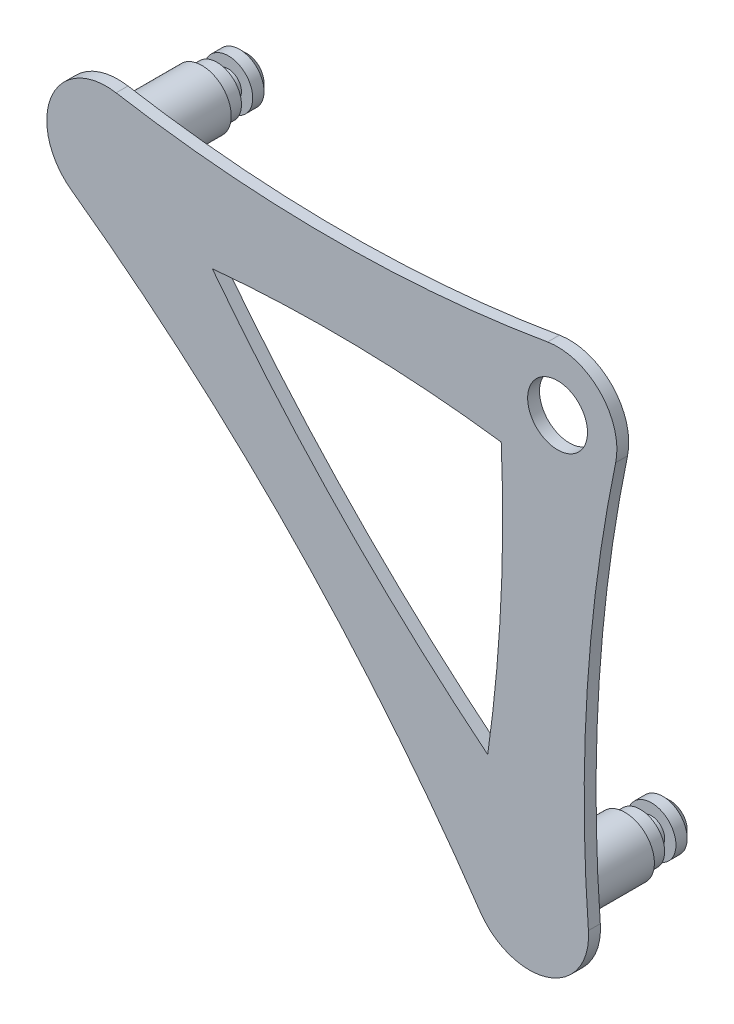
ISO-10303-21;
HEADER;
FILE_DESCRIPTION(('STEP AP214'),'2;1');
FILE_NAME('part.step','',(''),(''),'','','');
FILE_SCHEMA(('AUTOMOTIVE_DESIGN { 1 0 10303 214 1 1 1 1 }'));
ENDSEC;
DATA;
#1=APPLICATION_CONTEXT('core data for automotive mechanical design processes');
#2=APPLICATION_PROTOCOL_DEFINITION('international standard','automotive_design',2000,#1);
#3=PRODUCT_CONTEXT('',#1,'mechanical');
#4=PRODUCT('Part','Part','',(#3));
#5=PRODUCT_RELATED_PRODUCT_CATEGORY('part','',(#4));
#6=PRODUCT_DEFINITION_FORMATION('','',#4);
#7=PRODUCT_DEFINITION_CONTEXT('part definition',#1,'design');
#8=PRODUCT_DEFINITION('design','',#6,#7);
#9=PRODUCT_DEFINITION_SHAPE('','',#8);
#10=(LENGTH_UNIT() NAMED_UNIT(*) SI_UNIT(.MILLI.,.METRE.));
#11=(NAMED_UNIT(*) PLANE_ANGLE_UNIT() SI_UNIT($,.RADIAN.));
#12=(NAMED_UNIT(*) SI_UNIT($,.STERADIAN.) SOLID_ANGLE_UNIT());
#13=UNCERTAINTY_MEASURE_WITH_UNIT(LENGTH_MEASURE(1.E-05),#10,'distance_accuracy_value','');
#14=(GEOMETRIC_REPRESENTATION_CONTEXT(3) GLOBAL_UNCERTAINTY_ASSIGNED_CONTEXT((#13)) GLOBAL_UNIT_ASSIGNED_CONTEXT((#10,
#11,#12)) REPRESENTATION_CONTEXT('',''));
#15=CARTESIAN_POINT('',(0.,0.,0.));
#16=DIRECTION('',(0.,0.,1.));
#17=DIRECTION('',(1.,0.,0.));
#18=AXIS2_PLACEMENT_3D('',#15,#16,#17);
#19=CARTESIAN_POINT('',(-3.76712370962372,-57.9075960384852,-18.76));
#20=DIRECTION('',(0.,0.,1.));
#21=DIRECTION('',(-1.,0.,0.));
#22=AXIS2_PLACEMENT_3D('',#19,#20,#21);
#23=CYLINDRICAL_SURFACE('',#22,3.25);
#24=CARTESIAN_POINT('',(-3.76712370962372,-57.9075960384852,-12.76));
#25=DIRECTION('',(0.,0.,1.));
#26=DIRECTION('',(1.,0.,0.));
#27=AXIS2_PLACEMENT_3D('',#24,#25,#26);
#28=CIRCLE('',#27,3.25);
#29=CARTESIAN_POINT('',(-0.517123709623721,-57.9075960384852,-12.76));
#30=VERTEX_POINT('',#29);
#31=EDGE_CURVE('E191',#30,#30,#28,.T.);
#32=ORIENTED_EDGE('',*,*,#31,.F.);
#33=EDGE_LOOP('',(#32));
#34=FACE_BOUND('',#33,.T.);
#35=CARTESIAN_POINT('',(-3.76712370962372,-57.9075960384852,-14.76));
#36=DIRECTION('',(0.,0.,1.));
#37=DIRECTION('',(1.,0.,0.));
#38=AXIS2_PLACEMENT_3D('',#35,#36,#37);
#39=CIRCLE('',#38,3.25);
#40=CARTESIAN_POINT('',(-0.51712370962372,-57.9075960384852,-14.76));
#41=VERTEX_POINT('',#40);
#42=EDGE_CURVE('E318',#41,#41,#39,.T.);
#43=ORIENTED_EDGE('',*,*,#42,.T.);
#44=EDGE_LOOP('',(#43));
#45=FACE_BOUND('',#44,.T.);
#46=ADVANCED_FACE('F47',(#34,#45),#23,.T.);
#47=CARTESIAN_POINT('',(-60.06,0.,-18.76));
#48=DIRECTION('',(0.,0.,1.));
#49=DIRECTION('',(-1.,0.,0.));
#50=AXIS2_PLACEMENT_3D('',#47,#48,#49);
#51=CYLINDRICAL_SURFACE('',#50,3.25);
#52=CARTESIAN_POINT('',(-60.06,0.,-12.76));
#53=DIRECTION('',(0.,0.,1.));
#54=DIRECTION('',(1.,0.,0.));
#55=AXIS2_PLACEMENT_3D('',#52,#53,#54);
#56=CIRCLE('',#55,3.25);
#57=CARTESIAN_POINT('',(-56.81,0.,-12.76));
#58=VERTEX_POINT('',#57);
#59=EDGE_CURVE('E203',#58,#58,#56,.T.);
#60=ORIENTED_EDGE('',*,*,#59,.F.);
#61=EDGE_LOOP('',(#60));
#62=FACE_BOUND('',#61,.T.);
#63=CARTESIAN_POINT('',(-60.06,0.,-14.76));
#64=DIRECTION('',(0.,0.,1.));
#65=DIRECTION('',(1.,0.,0.));
#66=AXIS2_PLACEMENT_3D('',#63,#64,#65);
#67=CIRCLE('',#66,3.25);
#68=CARTESIAN_POINT('',(-56.81,0.,-14.76));
#69=VERTEX_POINT('',#68);
#70=EDGE_CURVE('E315',#69,#69,#67,.T.);
#71=ORIENTED_EDGE('',*,*,#70,.T.);
#72=EDGE_LOOP('',(#71));
#73=FACE_BOUND('',#72,.T.);
#74=ADVANCED_FACE('F224',(#62,#73),#51,.T.);
#75=CARTESIAN_POINT('',(-30.03,175.33696472792,-1.58));
#76=DIRECTION('',(0.,0.,1.));
#77=DIRECTION('',(-1.,0.,0.));
#78=AXIS2_PLACEMENT_3D('',#75,#76,#77);
#79=CYLINDRICAL_SURFACE('',#78,170.);
#80=CARTESIAN_POINT('',(-30.03,175.33696472792,0.));
#81=DIRECTION('',(0.,0.,1.));
#82=DIRECTION('',(1.,0.,0.));
#83=AXIS2_PLACEMENT_3D('',#80,#81,#82);
#84=CIRCLE('',#83,170.);
#85=CARTESIAN_POINT('',(-1.33192815785036,7.77676458318788,0.));
#86=VERTEX_POINT('',#85);
#87=CARTESIAN_POINT('',(-58.7280718421496,7.77676458318788,0.));
#88=VERTEX_POINT('',#87);
#89=EDGE_CURVE('E164',#86,#88,#84,.F.);
#90=ORIENTED_EDGE('',*,*,#89,.F.);
#91=DIRECTION('',(0.,0.,1.));
#92=VECTOR('',#91,1.);
#93=CARTESIAN_POINT('',(-1.33192815785036,7.77676458318788,-1.58));
#94=LINE('',#93,#92);
#95=CARTESIAN_POINT('',(-1.33192815785036,7.77676458318788,-1.58));
#96=VERTEX_POINT('',#95);
#97=EDGE_CURVE('E180',#96,#86,#94,.T.);
#98=ORIENTED_EDGE('',*,*,#97,.F.);
#99=CARTESIAN_POINT('',(-30.03,175.33696472792,-1.58));
#100=DIRECTION('',(0.,0.,1.));
#101=DIRECTION('',(1.,0.,0.));
#102=AXIS2_PLACEMENT_3D('',#99,#100,#101);
#103=CIRCLE('',#102,170.);
#104=CARTESIAN_POINT('',(-58.7280718421496,7.77676458318788,-1.58));
#105=VERTEX_POINT('',#104);
#106=EDGE_CURVE('E352',#96,#105,#103,.F.);
#107=ORIENTED_EDGE('',*,*,#106,.T.);
#108=DIRECTION('',(0.,0.,1.));
#109=VECTOR('',#108,1.);
#110=CARTESIAN_POINT('',(-58.7280718421496,7.77676458318788,-1.58));
#111=LINE('',#110,#109);
#112=EDGE_CURVE('E188',#105,#88,#111,.T.);
#113=ORIENTED_EDGE('',*,*,#112,.T.);
#114=EDGE_LOOP('',(#90,#98,#107,#113));
#115=FACE_BOUND('',#114,.T.);
#116=ADVANCED_FACE('F231',(#115),#79,.F.);
#117=CARTESIAN_POINT('',(-60.06,0.,-1.58));
#118=DIRECTION('',(0.,0.,1.));
#119=DIRECTION('',(-1.,0.,0.));
#120=AXIS2_PLACEMENT_3D('',#117,#118,#119);
#121=CYLINDRICAL_SURFACE('',#120,7.89);
#122=CARTESIAN_POINT('',(-60.06,0.,0.));
#123=DIRECTION('',(0.,0.,1.));
#124=DIRECTION('',(1.,0.,0.));
#125=AXIS2_PLACEMENT_3D('',#122,#123,#124);
#126=CIRCLE('',#125,7.89);
#127=CARTESIAN_POINT('',(-64.6781402375793,-6.39725571992014,0.));
#128=VERTEX_POINT('',#127);
#129=EDGE_CURVE('E166',#88,#128,#126,.T.);
#130=ORIENTED_EDGE('',*,*,#129,.F.);
#131=ORIENTED_EDGE('',*,*,#112,.F.);
#132=CARTESIAN_POINT('',(-60.06,0.,-1.58));
#133=DIRECTION('',(0.,0.,1.));
#134=DIRECTION('',(1.,0.,0.));
#135=AXIS2_PLACEMENT_3D('',#132,#133,#134);
#136=CIRCLE('',#135,7.89);
#137=CARTESIAN_POINT('',(-64.6781402375793,-6.39725571992014,-1.58));
#138=VERTEX_POINT('',#137);
#139=EDGE_CURVE('E147',#105,#138,#136,.T.);
#140=ORIENTED_EDGE('',*,*,#139,.T.);
#141=DIRECTION('',(0.,0.,1.));
#142=VECTOR('',#141,1.);
#143=CARTESIAN_POINT('',(-64.6781402375793,-6.39725571992014,-1.58));
#144=LINE('',#143,#142);
#145=EDGE_CURVE('E185',#138,#128,#144,.T.);
#146=ORIENTED_EDGE('',*,*,#145,.T.);
#147=EDGE_LOOP('',(#130,#131,#140,#146));
#148=FACE_BOUND('',#147,.T.);
#149=ADVANCED_FACE('F281',(#148),#121,.T.);
#150=CARTESIAN_POINT('',(-196.374154617217,-188.828502485704,-1.58));
#151=DIRECTION('',(0.,0.,1.));
#152=DIRECTION('',(-1.,0.,0.));
#153=AXIS2_PLACEMENT_3D('',#150,#151,#152);
#154=CYLINDRICAL_SURFACE('',#153,225.);
#155=CARTESIAN_POINT('',(-196.374154617217,-188.828502485704,0.));
#156=DIRECTION('',(0.,0.,1.));
#157=DIRECTION('',(1.,0.,0.));
#158=AXIS2_PLACEMENT_3D('',#155,#156,#157);
#159=CIRCLE('',#158,225.);
#160=CARTESIAN_POINT('',(-10.2923908909579,-62.3430202811258,0.));
#161=VERTEX_POINT('',#160);
#162=EDGE_CURVE('E169',#128,#161,#159,.F.);
#163=ORIENTED_EDGE('',*,*,#162,.F.);
#164=ORIENTED_EDGE('',*,*,#145,.F.);
#165=CARTESIAN_POINT('',(-196.374154617217,-188.828502485704,-1.58));
#166=DIRECTION('',(0.,0.,1.));
#167=DIRECTION('',(1.,0.,0.));
#168=AXIS2_PLACEMENT_3D('',#165,#166,#167);
#169=CIRCLE('',#168,225.);
#170=CARTESIAN_POINT('',(-10.2923908909579,-62.3430202811258,-1.58));
#171=VERTEX_POINT('',#170);
#172=EDGE_CURVE('E145',#138,#171,#169,.F.);
#173=ORIENTED_EDGE('',*,*,#172,.T.);
#174=DIRECTION('',(0.,0.,1.));
#175=VECTOR('',#174,1.);
#176=CARTESIAN_POINT('',(-10.2923908909579,-62.3430202811258,-1.58));
#177=LINE('',#176,#175);
#178=EDGE_CURVE('E139',#171,#161,#177,.T.);
#179=ORIENTED_EDGE('',*,*,#178,.T.);
#180=EDGE_LOOP('',(#163,#164,#173,#179));
#181=FACE_BOUND('',#180,.T.);
#182=ADVANCED_FACE('F278',(#181),#154,.F.);
#183=CARTESIAN_POINT('',(-3.76712370962372,-57.9075960384852,-1.58));
#184=DIRECTION('',(0.,0.,1.));
#185=DIRECTION('',(-1.,0.,0.));
#186=AXIS2_PLACEMENT_3D('',#183,#184,#185);
#187=CYLINDRICAL_SURFACE('',#186,7.89);
#188=CARTESIAN_POINT('',(-3.76712370962372,-57.9075960384852,0.));
#189=DIRECTION('',(0.,0.,1.));
#190=DIRECTION('',(1.,0.,0.));
#191=AXIS2_PLACEMENT_3D('',#188,#189,#190);
#192=CIRCLE('',#191,7.89);
#193=CARTESIAN_POINT('',(4.10065843107563,-57.3159000130698,0.));
#194=VERTEX_POINT('',#193);
#195=EDGE_CURVE('E172',#161,#194,#192,.T.);
#196=ORIENTED_EDGE('',*,*,#195,.F.);
#197=ORIENTED_EDGE('',*,*,#178,.F.);
#198=CARTESIAN_POINT('',(-3.76712370962372,-57.9075960384852,-1.58));
#199=DIRECTION('',(0.,0.,1.));
#200=DIRECTION('',(1.,0.,0.));
#201=AXIS2_PLACEMENT_3D('',#198,#199,#200);
#202=CIRCLE('',#201,7.89);
#203=CARTESIAN_POINT('',(4.10065843107563,-57.3159000130698,-1.58));
#204=VERTEX_POINT('',#203);
#205=EDGE_CURVE('E129',#171,#204,#202,.T.);
#206=ORIENTED_EDGE('',*,*,#205,.T.);
#207=DIRECTION('',(0.,0.,1.));
#208=VECTOR('',#207,1.);
#209=CARTESIAN_POINT('',(4.10065843107563,-57.3159000130698,-1.58));
#210=LINE('',#209,#208);
#211=EDGE_CURVE('E134',#204,#194,#210,.T.);
#212=ORIENTED_EDGE('',*,*,#211,.T.);
#213=EDGE_LOOP('',(#196,#197,#206,#212));
#214=FACE_BOUND('',#213,.T.);
#215=ADVANCED_FACE('F142',(#214),#187,.T.);
#216=CARTESIAN_POINT('',(203.537468081249,-42.317268190119,-1.58));
#217=DIRECTION('',(0.,0.,1.));
#218=DIRECTION('',(-1.,0.,0.));
#219=AXIS2_PLACEMENT_3D('',#216,#217,#218);
#220=CYLINDRICAL_SURFACE('',#219,200.);
#221=CARTESIAN_POINT('',(203.537468081249,-42.317268190119,0.));
#222=DIRECTION('',(0.,0.,1.));
#223=DIRECTION('',(1.,0.,0.));
#224=AXIS2_PLACEMENT_3D('',#221,#222,#223);
#225=CIRCLE('',#224,200.);
#226=CARTESIAN_POINT('',(7.72480938554551,-1.60605727076838,0.));
#227=VERTEX_POINT('',#226);
#228=EDGE_CURVE('E136',#194,#227,#225,.F.);
#229=ORIENTED_EDGE('',*,*,#228,.F.);
#230=ORIENTED_EDGE('',*,*,#211,.F.);
#231=CARTESIAN_POINT('',(203.537468081249,-42.317268190119,-1.58));
#232=DIRECTION('',(0.,0.,1.));
#233=DIRECTION('',(1.,0.,0.));
#234=AXIS2_PLACEMENT_3D('',#231,#232,#233);
#235=CIRCLE('',#234,200.);
#236=CARTESIAN_POINT('',(7.72480938554551,-1.60605727076838,-1.58));
#237=VERTEX_POINT('',#236);
#238=EDGE_CURVE('E124',#204,#237,#235,.F.);
#239=ORIENTED_EDGE('',*,*,#238,.T.);
#240=DIRECTION('',(0.,0.,1.));
#241=VECTOR('',#240,1.);
#242=CARTESIAN_POINT('',(7.72480938554551,-1.60605727076838,-1.58));
#243=LINE('',#242,#241);
#244=EDGE_CURVE('E140',#237,#227,#243,.T.);
#245=ORIENTED_EDGE('',*,*,#244,.T.);
#246=EDGE_LOOP('',(#229,#230,#239,#245));
#247=FACE_BOUND('',#246,.T.);
#248=ADVANCED_FACE('F135',(#247),#220,.F.);
#249=CARTESIAN_POINT('',(132.547030907594,130.920906447219,-1.58));
#250=DIRECTION('',(0.,0.,1.));
#251=DIRECTION('',(-1.,0.,0.));
#252=AXIS2_PLACEMENT_3D('',#249,#250,#251);
#253=CYLINDRICAL_SURFACE('',#252,225.);
#254=CARTESIAN_POINT('',(132.547030907594,130.920906447219,0.));
#255=DIRECTION('',(0.,0.,1.));
#256=DIRECTION('',(1.,0.,0.));
#257=AXIS2_PLACEMENT_3D('',#254,#255,#256);
#258=CIRCLE('',#257,225.);
#259=CARTESIAN_POINT('',(-45.9329006907997,-6.08242933929762,0.));
#260=VERTEX_POINT('',#259);
#261=CARTESIAN_POINT('',(-9.29524167465698,-43.7381033653376,0.));
#262=VERTEX_POINT('',#261);
#263=EDGE_CURVE('E156',#260,#262,#258,.T.);
#264=ORIENTED_EDGE('',*,*,#263,.T.);
#265=DIRECTION('',(0.,0.,1.));
#266=VECTOR('',#265,1.);
#267=CARTESIAN_POINT('',(-9.29524167465698,-43.7381033653376,-1.58));
#268=LINE('',#267,#266);
#269=CARTESIAN_POINT('',(-9.29524167465698,-43.7381033653376,-1.58));
#270=VERTEX_POINT('',#269);
#271=EDGE_CURVE('E155',#270,#262,#268,.T.);
#272=ORIENTED_EDGE('',*,*,#271,.F.);
#273=CARTESIAN_POINT('',(132.547030907594,130.920906447219,-1.58));
#274=DIRECTION('',(0.,0.,1.));
#275=DIRECTION('',(1.,0.,0.));
#276=AXIS2_PLACEMENT_3D('',#273,#274,#275);
#277=CIRCLE('',#276,225.);
#278=CARTESIAN_POINT('',(-45.9329006907997,-6.08242933929762,-1.58));
#279=VERTEX_POINT('',#278);
#280=EDGE_CURVE('E179',#279,#270,#277,.T.);
#281=ORIENTED_EDGE('',*,*,#280,.F.);
#282=DIRECTION('',(0.,0.,1.));
#283=VECTOR('',#282,1.);
#284=CARTESIAN_POINT('',(-45.9329006907997,-6.08242933929762,-1.58));
#285=LINE('',#284,#283);
#286=EDGE_CURVE('E182',#279,#260,#285,.T.);
#287=ORIENTED_EDGE('',*,*,#286,.T.);
#288=EDGE_LOOP('',(#264,#272,#281,#287));
#289=FACE_BOUND('',#288,.T.);
#290=ADVANCED_FACE('F275',(#289),#253,.F.);
#291=CARTESIAN_POINT('',(-30.03,-175.33696472792,-1.58));
#292=DIRECTION('',(0.,0.,1.));
#293=DIRECTION('',(-1.,0.,0.));
#294=AXIS2_PLACEMENT_3D('',#291,#292,#293);
#295=CYLINDRICAL_SURFACE('',#294,170.);
#296=CARTESIAN_POINT('',(-30.03,-175.33696472792,0.));
#297=DIRECTION('',(0.,0.,1.));
#298=DIRECTION('',(1.,0.,0.));
#299=AXIS2_PLACEMENT_3D('',#296,#297,#298);
#300=CIRCLE('',#299,170.);
#301=CARTESIAN_POINT('',(-7.49623434821273,-6.83702583905808,0.));
#302=VERTEX_POINT('',#301);
#303=EDGE_CURVE('E159',#302,#260,#300,.T.);
#304=ORIENTED_EDGE('',*,*,#303,.T.);
#305=ORIENTED_EDGE('',*,*,#286,.F.);
#306=CARTESIAN_POINT('',(-30.03,-175.33696472792,-1.58));
#307=DIRECTION('',(0.,0.,1.));
#308=DIRECTION('',(1.,0.,0.));
#309=AXIS2_PLACEMENT_3D('',#306,#307,#308);
#310=CIRCLE('',#309,170.);
#311=CARTESIAN_POINT('',(-7.49623434821273,-6.83702583905808,-1.58));
#312=VERTEX_POINT('',#311);
#313=EDGE_CURVE('E106',#312,#279,#310,.T.);
#314=ORIENTED_EDGE('',*,*,#313,.F.);
#315=DIRECTION('',(0.,0.,1.));
#316=VECTOR('',#315,1.);
#317=CARTESIAN_POINT('',(-7.49623434821273,-6.83702583905808,-1.58));
#318=LINE('',#317,#316);
#319=EDGE_CURVE('E194',#312,#302,#318,.T.);
#320=ORIENTED_EDGE('',*,*,#319,.T.);
#321=EDGE_LOOP('',(#304,#305,#314,#320));
#322=FACE_BOUND('',#321,.T.);
#323=ADVANCED_FACE('F272',(#322),#295,.F.);
#324=CARTESIAN_POINT('',(0.,0.,-1.58));
#325=DIRECTION('',(0.,0.,1.));
#326=DIRECTION('',(-1.,0.,0.));
#327=AXIS2_PLACEMENT_3D('',#324,#325,#326);
#328=CYLINDRICAL_SURFACE('',#327,7.89);
#329=CARTESIAN_POINT('',(0.,0.,0.));
#330=DIRECTION('',(0.,0.,1.));
#331=DIRECTION('',(1.,0.,0.));
#332=AXIS2_PLACEMENT_3D('',#329,#330,#331);
#333=CIRCLE('',#332,7.89);
#334=EDGE_CURVE('E93',#227,#86,#333,.T.);
#335=ORIENTED_EDGE('',*,*,#334,.F.);
#336=ORIENTED_EDGE('',*,*,#244,.F.);
#337=CARTESIAN_POINT('',(0.,0.,-1.58));
#338=DIRECTION('',(0.,0.,1.));
#339=DIRECTION('',(1.,0.,0.));
#340=AXIS2_PLACEMENT_3D('',#337,#338,#339);
#341=CIRCLE('',#340,7.89);
#342=EDGE_CURVE('E64',#237,#96,#341,.T.);
#343=ORIENTED_EDGE('',*,*,#342,.T.);
#344=ORIENTED_EDGE('',*,*,#97,.T.);
#345=EDGE_LOOP('',(#335,#336,#343,#344));
#346=FACE_BOUND('',#345,.T.);
#347=ADVANCED_FACE('F269',(#346),#328,.T.);
#348=CARTESIAN_POINT('',(-207.304591790873,-15.5903278483662,-1.58));
#349=DIRECTION('',(0.,0.,1.));
#350=DIRECTION('',(-1.,0.,0.));
#351=AXIS2_PLACEMENT_3D('',#348,#349,#350);
#352=CYLINDRICAL_SURFACE('',#351,200.);
#353=CARTESIAN_POINT('',(-207.304591790873,-15.5903278483662,0.));
#354=DIRECTION('',(0.,0.,1.));
#355=DIRECTION('',(1.,0.,0.));
#356=AXIS2_PLACEMENT_3D('',#353,#354,#355);
#357=CIRCLE('',#356,200.);
#358=EDGE_CURVE('E162',#262,#302,#357,.T.);
#359=ORIENTED_EDGE('',*,*,#358,.T.);
#360=ORIENTED_EDGE('',*,*,#319,.F.);
#361=CARTESIAN_POINT('',(-207.304591790873,-15.5903278483662,-1.58));
#362=DIRECTION('',(0.,0.,1.));
#363=DIRECTION('',(1.,0.,0.));
#364=AXIS2_PLACEMENT_3D('',#361,#362,#363);
#365=CIRCLE('',#364,200.);
#366=EDGE_CURVE('E350',#270,#312,#365,.T.);
#367=ORIENTED_EDGE('',*,*,#366,.F.);
#368=ORIENTED_EDGE('',*,*,#271,.T.);
#369=EDGE_LOOP('',(#359,#360,#367,#368));
#370=FACE_BOUND('',#369,.T.);
#371=ADVANCED_FACE('F267',(#370),#352,.F.);
#372=CARTESIAN_POINT('',(0.,0.,-1.58));
#373=DIRECTION('',(0.,0.,1.));
#374=DIRECTION('',(-1.,0.,0.));
#375=AXIS2_PLACEMENT_3D('',#372,#373,#374);
#376=CYLINDRICAL_SURFACE('',#375,3.985);
#377=CARTESIAN_POINT('',(0.,0.,-1.58));
#378=DIRECTION('',(0.,0.,1.));
#379=DIRECTION('',(1.,0.,0.));
#380=AXIS2_PLACEMENT_3D('',#377,#378,#379);
#381=CIRCLE('',#380,3.985);
#382=CARTESIAN_POINT('',(-3.985,0.,-1.58));
#383=VERTEX_POINT('',#382);
#384=EDGE_CURVE('E152',#383,#383,#381,.T.);
#385=CARTESIAN_POINT('',(0.,0.,0.));
#386=DIRECTION('',(0.,0.,1.));
#387=DIRECTION('',(1.,0.,0.));
#388=AXIS2_PLACEMENT_3D('',#385,#386,#387);
#389=CIRCLE('',#388,3.985);
#390=CARTESIAN_POINT('',(-3.985,0.,0.));
#391=VERTEX_POINT('',#390);
#392=EDGE_CURVE('E176',#391,#391,#389,.T.);
#393=CARTESIAN_POINT('',(-3.985,0.,-1.58));
#394=CARTESIAN_POINT('',(-3.985,0.,-1.56354166666667));
#395=CARTESIAN_POINT('',(-3.985,0.,-1.54708333333333));
#396=CARTESIAN_POINT('',(-3.985,0.,-1.51416666666667));
#397=CARTESIAN_POINT('',(-3.985,0.,-1.49770833333333));
#398=CARTESIAN_POINT('',(-3.985,0.,-1.46479166666667));
#399=CARTESIAN_POINT('',(-3.985,0.,-1.44833333333333));
#400=CARTESIAN_POINT('',(-3.985,0.,-1.41541666666667));
#401=CARTESIAN_POINT('',(-3.985,0.,-1.39895833333333));
#402=CARTESIAN_POINT('',(-3.985,0.,-1.36604166666667));
#403=CARTESIAN_POINT('',(-3.985,0.,-1.34958333333333));
#404=CARTESIAN_POINT('',(-3.985,0.,-1.31666666666667));
#405=CARTESIAN_POINT('',(-3.985,0.,-1.30020833333333));
#406=CARTESIAN_POINT('',(-3.985,0.,-1.26729166666667));
#407=CARTESIAN_POINT('',(-3.985,0.,-1.25083333333333));
#408=CARTESIAN_POINT('',(-3.985,0.,-1.21791666666667));
#409=CARTESIAN_POINT('',(-3.985,0.,-1.20145833333333));
#410=CARTESIAN_POINT('',(-3.985,0.,-1.16854166666667));
#411=CARTESIAN_POINT('',(-3.985,0.,-1.15208333333333));
#412=CARTESIAN_POINT('',(-3.985,0.,-1.11916666666667));
#413=CARTESIAN_POINT('',(-3.985,0.,-1.10270833333333));
#414=CARTESIAN_POINT('',(-3.985,0.,-1.06979166666667));
#415=CARTESIAN_POINT('',(-3.985,0.,-1.05333333333333));
#416=CARTESIAN_POINT('',(-3.985,0.,-1.02041666666667));
#417=CARTESIAN_POINT('',(-3.985,0.,-1.00395833333333));
#418=CARTESIAN_POINT('',(-3.985,0.,-0.971041666666667));
#419=CARTESIAN_POINT('',(-3.985,0.,-0.954583333333333));
#420=CARTESIAN_POINT('',(-3.985,0.,-0.921666666666667));
#421=CARTESIAN_POINT('',(-3.985,0.,-0.905208333333333));
#422=CARTESIAN_POINT('',(-3.985,0.,-0.872291666666667));
#423=CARTESIAN_POINT('',(-3.985,0.,-0.855833333333333));
#424=CARTESIAN_POINT('',(-3.985,0.,-0.822916666666667));
#425=CARTESIAN_POINT('',(-3.985,0.,-0.806458333333333));
#426=CARTESIAN_POINT('',(-3.985,0.,-0.773541666666667));
#427=CARTESIAN_POINT('',(-3.985,0.,-0.757083333333333));
#428=CARTESIAN_POINT('',(-3.985,0.,-0.724166666666667));
#429=CARTESIAN_POINT('',(-3.985,0.,-0.707708333333333));
#430=CARTESIAN_POINT('',(-3.985,0.,-0.674791666666667));
#431=CARTESIAN_POINT('',(-3.985,0.,-0.658333333333333));
#432=CARTESIAN_POINT('',(-3.985,0.,-0.625416666666667));
#433=CARTESIAN_POINT('',(-3.985,0.,-0.608958333333333));
#434=CARTESIAN_POINT('',(-3.985,0.,-0.576041666666667));
#435=CARTESIAN_POINT('',(-3.985,0.,-0.559583333333333));
#436=CARTESIAN_POINT('',(-3.985,0.,-0.526666666666667));
#437=CARTESIAN_POINT('',(-3.985,0.,-0.510208333333333));
#438=CARTESIAN_POINT('',(-3.985,0.,-0.477291666666667));
#439=CARTESIAN_POINT('',(-3.985,0.,-0.460833333333333));
#440=CARTESIAN_POINT('',(-3.985,0.,-0.427916666666667));
#441=CARTESIAN_POINT('',(-3.985,0.,-0.411458333333333));
#442=CARTESIAN_POINT('',(-3.985,0.,-0.378541666666667));
#443=CARTESIAN_POINT('',(-3.985,0.,-0.362083333333333));
#444=CARTESIAN_POINT('',(-3.985,0.,-0.329166666666667));
#445=CARTESIAN_POINT('',(-3.985,0.,-0.312708333333333));
#446=CARTESIAN_POINT('',(-3.985,0.,-0.279791666666667));
#447=CARTESIAN_POINT('',(-3.985,0.,-0.263333333333333));
#448=CARTESIAN_POINT('',(-3.985,0.,-0.230416666666667));
#449=CARTESIAN_POINT('',(-3.985,0.,-0.213958333333333));
#450=CARTESIAN_POINT('',(-3.985,0.,-0.181041666666667));
#451=CARTESIAN_POINT('',(-3.985,0.,-0.164583333333333));
#452=CARTESIAN_POINT('',(-3.985,0.,-0.131666666666667));
#453=CARTESIAN_POINT('',(-3.985,0.,-0.115208333333333));
#454=CARTESIAN_POINT('',(-3.985,0.,-0.0822916666666667));
#455=CARTESIAN_POINT('',(-3.985,0.,-0.0658333333333333));
#456=CARTESIAN_POINT('',(-3.985,0.,-0.0329166666666666));
#457=CARTESIAN_POINT('',(-3.985,0.,-0.0164583333333333));
#458=CARTESIAN_POINT('',(-3.985,0.,0.));
#459=B_SPLINE_CURVE_WITH_KNOTS('',3,(#393,#394,#395,#396,#397,#398,#399,#400,#401,#402,#403,
#404,#405,#406,#407,#408,#409,#410,#411,#412,#413,#414,#415,#416,#417,#418,#419,#420,#421,#422,
#423,#424,#425,#426,#427,#428,#429,#430,#431,#432,#433,#434,#435,#436,#437,#438,#439,#440,#441,
#442,#443,#444,#445,#446,#447,#448,#449,#450,#451,#452,#453,#454,#455,#456,#457,#458),
.UNSPECIFIED.,.F.,.F.,(4,2,2,2,2,2,2,2,2,2,2,2,2,2,2,2,2,2,2,2,2,2,2,2,2,2,2,2,2,2,2,2,4),(0.,
0.0493750000000002,0.0987500000000001,0.148125,0.1975,0.246875,0.29625,0.345625,0.395,0.444375,
0.49375,0.543125,0.5925,0.641875,0.69125,0.740625,0.79,0.839375,0.88875,0.938125,0.9875,
1.036875,1.08625,1.135625,1.185,1.234375,1.28375,1.333125,1.3825,1.431875,1.48125,1.530625,
1.58),.UNSPECIFIED.);
#460=EDGE_CURVE('BSEAM260',#383,#391,#459,.T.);
#461=ORIENTED_EDGE('',*,*,#384,.F.);
#462=ORIENTED_EDGE('',*,*,#392,.T.);
#463=ORIENTED_EDGE('',*,*,#460,.T.);
#464=ORIENTED_EDGE('',*,*,#460,.F.);
#465=EDGE_LOOP('',(#461,#463,#462,#464));
#466=FACE_BOUND('',#465,.T.);
#467=ADVANCED_FACE('F260',(#466),#376,.F.);
#468=CARTESIAN_POINT('',(0.,0.,-1.58));
#469=DIRECTION('',(0.,0.,-1.));
#470=DIRECTION('',(1.,0.,0.));
#471=AXIS2_PLACEMENT_3D('',#468,#469,#470);
#472=PLANE('',#471);
#473=CARTESIAN_POINT('',(-3.76712370962372,-57.9075960384852,-1.58));
#474=DIRECTION('',(0.,0.,1.));
#475=DIRECTION('',(1.,0.,0.));
#476=AXIS2_PLACEMENT_3D('',#473,#474,#475);
#477=CIRCLE('',#476,3.885);
#478=CARTESIAN_POINT('',(-7.65212370962372,-57.9075960384852,-1.58));
#479=VERTEX_POINT('',#478);
#480=EDGE_CURVE('E339',#479,#479,#477,.T.);
#481=ORIENTED_EDGE('',*,*,#480,.T.);
#482=EDGE_LOOP('',(#481));
#483=FACE_BOUND('',#482,.T.);
#484=CARTESIAN_POINT('',(-60.06,0.,-1.58));
#485=DIRECTION('',(0.,0.,1.));
#486=DIRECTION('',(1.,0.,0.));
#487=AXIS2_PLACEMENT_3D('',#484,#485,#486);
#488=CIRCLE('',#487,3.885);
#489=CARTESIAN_POINT('',(-63.945,0.,-1.58));
#490=VERTEX_POINT('',#489);
#491=EDGE_CURVE('E342',#490,#490,#488,.T.);
#492=ORIENTED_EDGE('',*,*,#491,.T.);
#493=EDGE_LOOP('',(#492));
#494=FACE_BOUND('',#493,.T.);
#495=ORIENTED_EDGE('',*,*,#280,.T.);
#496=ORIENTED_EDGE('',*,*,#366,.T.);
#497=ORIENTED_EDGE('',*,*,#313,.T.);
#498=EDGE_LOOP('',(#495,#496,#497));
#499=FACE_BOUND('',#498,.T.);
#500=ORIENTED_EDGE('',*,*,#106,.F.);
#501=ORIENTED_EDGE('',*,*,#342,.F.);
#502=ORIENTED_EDGE('',*,*,#238,.F.);
#503=ORIENTED_EDGE('',*,*,#205,.F.);
#504=ORIENTED_EDGE('',*,*,#172,.F.);
#505=ORIENTED_EDGE('',*,*,#139,.F.);
#506=EDGE_LOOP('',(#500,#501,#502,#503,#504,#505));
#507=FACE_BOUND('',#506,.T.);
#508=ORIENTED_EDGE('',*,*,#384,.T.);
#509=EDGE_LOOP('',(#508));
#510=FACE_BOUND('',#509,.T.);
#511=ADVANCED_FACE('F126',(#483,#494,#499,#507,#510),#472,.T.);
#512=CARTESIAN_POINT('',(0.,0.,0.));
#513=DIRECTION('',(0.,0.,-1.));
#514=DIRECTION('',(1.,0.,0.));
#515=AXIS2_PLACEMENT_3D('',#512,#513,#514);
#516=PLANE('',#515);
#517=ORIENTED_EDGE('',*,*,#263,.F.);
#518=ORIENTED_EDGE('',*,*,#303,.F.);
#519=ORIENTED_EDGE('',*,*,#358,.F.);
#520=EDGE_LOOP('',(#517,#518,#519));
#521=FACE_BOUND('',#520,.T.);
#522=ORIENTED_EDGE('',*,*,#89,.T.);
#523=ORIENTED_EDGE('',*,*,#129,.T.);
#524=ORIENTED_EDGE('',*,*,#162,.T.);
#525=ORIENTED_EDGE('',*,*,#195,.T.);
#526=ORIENTED_EDGE('',*,*,#228,.T.);
#527=ORIENTED_EDGE('',*,*,#334,.T.);
#528=EDGE_LOOP('',(#522,#523,#524,#525,#526,#527));
#529=FACE_BOUND('',#528,.T.);
#530=ORIENTED_EDGE('',*,*,#392,.F.);
#531=EDGE_LOOP('',(#530));
#532=FACE_BOUND('',#531,.T.);
#533=ADVANCED_FACE('F253',(#521,#529,#532),#516,.F.);
#534=CARTESIAN_POINT('',(-60.06,0.,-12.76));
#535=DIRECTION('',(0.,0.,1.));
#536=DIRECTION('',(-1.,0.,0.));
#537=AXIS2_PLACEMENT_3D('',#534,#535,#536);
#538=CYLINDRICAL_SURFACE('',#537,3.885);
#539=CARTESIAN_POINT('',(-60.06,0.,-12.76));
#540=DIRECTION('',(0.,0.,1.));
#541=DIRECTION('',(1.,0.,0.));
#542=AXIS2_PLACEMENT_3D('',#539,#540,#541);
#543=CIRCLE('',#542,3.885);
#544=CARTESIAN_POINT('',(-63.945,0.,-12.76));
#545=VERTEX_POINT('',#544);
#546=EDGE_CURVE('E345',#545,#545,#543,.T.);
#547=CARTESIAN_POINT('',(-63.945,0.,-12.76));
#548=CARTESIAN_POINT('',(-63.945,0.,-12.6435416666667));
#549=CARTESIAN_POINT('',(-63.945,0.,-12.5270833333333));
#550=CARTESIAN_POINT('',(-63.945,0.,-12.2941666666667));
#551=CARTESIAN_POINT('',(-63.945,0.,-12.1777083333333));
#552=CARTESIAN_POINT('',(-63.945,0.,-11.9447916666667));
#553=CARTESIAN_POINT('',(-63.945,0.,-11.8283333333333));
#554=CARTESIAN_POINT('',(-63.945,0.,-11.5954166666667));
#555=CARTESIAN_POINT('',(-63.945,0.,-11.4789583333333));
#556=CARTESIAN_POINT('',(-63.945,0.,-11.2460416666667));
#557=CARTESIAN_POINT('',(-63.945,0.,-11.1295833333333));
#558=CARTESIAN_POINT('',(-63.945,0.,-10.8966666666667));
#559=CARTESIAN_POINT('',(-63.945,0.,-10.7802083333333));
#560=CARTESIAN_POINT('',(-63.945,0.,-10.5472916666667));
#561=CARTESIAN_POINT('',(-63.945,0.,-10.4308333333333));
#562=CARTESIAN_POINT('',(-63.945,0.,-10.1979166666667));
#563=CARTESIAN_POINT('',(-63.945,0.,-10.0814583333333));
#564=CARTESIAN_POINT('',(-63.945,0.,-9.84854166666667));
#565=CARTESIAN_POINT('',(-63.945,0.,-9.73208333333333));
#566=CARTESIAN_POINT('',(-63.945,0.,-9.49916666666667));
#567=CARTESIAN_POINT('',(-63.945,0.,-9.38270833333333));
#568=CARTESIAN_POINT('',(-63.945,0.,-9.14979166666667));
#569=CARTESIAN_POINT('',(-63.945,0.,-9.03333333333333));
#570=CARTESIAN_POINT('',(-63.945,0.,-8.80041666666667));
#571=CARTESIAN_POINT('',(-63.945,0.,-8.68395833333333));
#572=CARTESIAN_POINT('',(-63.945,0.,-8.45104166666667));
#573=CARTESIAN_POINT('',(-63.945,0.,-8.33458333333333));
#574=CARTESIAN_POINT('',(-63.945,0.,-8.10166666666667));
#575=CARTESIAN_POINT('',(-63.945,0.,-7.98520833333333));
#576=CARTESIAN_POINT('',(-63.945,0.,-7.75229166666667));
#577=CARTESIAN_POINT('',(-63.945,0.,-7.63583333333333));
#578=CARTESIAN_POINT('',(-63.945,0.,-7.40291666666667));
#579=CARTESIAN_POINT('',(-63.945,0.,-7.28645833333333));
#580=CARTESIAN_POINT('',(-63.945,0.,-7.05354166666667));
#581=CARTESIAN_POINT('',(-63.945,0.,-6.93708333333333));
#582=CARTESIAN_POINT('',(-63.945,0.,-6.70416666666667));
#583=CARTESIAN_POINT('',(-63.945,0.,-6.58770833333333));
#584=CARTESIAN_POINT('',(-63.945,0.,-6.35479166666667));
#585=CARTESIAN_POINT('',(-63.945,0.,-6.23833333333333));
#586=CARTESIAN_POINT('',(-63.945,0.,-6.00541666666667));
#587=CARTESIAN_POINT('',(-63.945,0.,-5.88895833333333));
#588=CARTESIAN_POINT('',(-63.945,0.,-5.65604166666667));
#589=CARTESIAN_POINT('',(-63.945,0.,-5.53958333333333));
#590=CARTESIAN_POINT('',(-63.945,0.,-5.30666666666667));
#591=CARTESIAN_POINT('',(-63.945,0.,-5.19020833333333));
#592=CARTESIAN_POINT('',(-63.945,0.,-4.95729166666667));
#593=CARTESIAN_POINT('',(-63.945,0.,-4.84083333333333));
#594=CARTESIAN_POINT('',(-63.945,0.,-4.60791666666667));
#595=CARTESIAN_POINT('',(-63.945,0.,-4.49145833333333));
#596=CARTESIAN_POINT('',(-63.945,0.,-4.25854166666667));
#597=CARTESIAN_POINT('',(-63.945,0.,-4.14208333333334));
#598=CARTESIAN_POINT('',(-63.945,0.,-3.90916666666667));
#599=CARTESIAN_POINT('',(-63.945,0.,-3.79270833333334));
#600=CARTESIAN_POINT('',(-63.945,0.,-3.55979166666667));
#601=CARTESIAN_POINT('',(-63.945,0.,-3.44333333333334));
#602=CARTESIAN_POINT('',(-63.945,0.,-3.21041666666667));
#603=CARTESIAN_POINT('',(-63.945,0.,-3.09395833333333));
#604=CARTESIAN_POINT('',(-63.945,0.,-2.86104166666667));
#605=CARTESIAN_POINT('',(-63.945,0.,-2.74458333333334));
#606=CARTESIAN_POINT('',(-63.945,0.,-2.51166666666667));
#607=CARTESIAN_POINT('',(-63.945,0.,-2.39520833333333));
#608=CARTESIAN_POINT('',(-63.945,0.,-2.16229166666667));
#609=CARTESIAN_POINT('',(-63.945,0.,-2.04583333333334));
#610=CARTESIAN_POINT('',(-63.945,0.,-1.81291666666667));
#611=CARTESIAN_POINT('',(-63.945,0.,-1.69645833333334));
#612=CARTESIAN_POINT('',(-63.945,0.,-1.58));
#613=B_SPLINE_CURVE_WITH_KNOTS('',3,(#547,#548,#549,#550,#551,#552,#553,#554,#555,#556,#557,
#558,#559,#560,#561,#562,#563,#564,#565,#566,#567,#568,#569,#570,#571,#572,#573,#574,#575,#576,
#577,#578,#579,#580,#581,#582,#583,#584,#585,#586,#587,#588,#589,#590,#591,#592,#593,#594,#595,
#596,#597,#598,#599,#600,#601,#602,#603,#604,#605,#606,#607,#608,#609,#610,#611,#612),
.UNSPECIFIED.,.F.,.F.,(4,2,2,2,2,2,2,2,2,2,2,2,2,2,2,2,2,2,2,2,2,2,2,2,2,2,2,2,2,2,2,2,4),(0.,
0.349375000000001,0.698750000000001,1.048125,1.3975,1.746875,2.09625,2.445625,2.795,3.144375,
3.49375,3.843125,4.1925,4.541875,4.89125,5.240625,5.59,5.939375,6.28875,6.638125,6.9875,
7.336875,7.68625,8.035625,8.385,8.734375,9.08375,9.433125,9.7825,10.131875,10.48125,10.830625,
11.18),.UNSPECIFIED.);
#614=EDGE_CURVE('BSEAM250',#545,#490,#613,.T.);
#615=ORIENTED_EDGE('',*,*,#546,.T.);
#616=ORIENTED_EDGE('',*,*,#491,.F.);
#617=ORIENTED_EDGE('',*,*,#614,.T.);
#618=ORIENTED_EDGE('',*,*,#614,.F.);
#619=EDGE_LOOP('',(#615,#617,#616,#618));
#620=FACE_BOUND('',#619,.T.);
#621=ADVANCED_FACE('F250',(#620),#538,.T.);
#622=CARTESIAN_POINT('',(-60.06,0.,-12.76));
#623=DIRECTION('',(0.,0.,-1.));
#624=DIRECTION('',(1.,0.,0.));
#625=AXIS2_PLACEMENT_3D('',#622,#623,#624);
#626=PLANE('',#625);
#627=ORIENTED_EDGE('',*,*,#59,.T.);
#628=EDGE_LOOP('',(#627));
#629=FACE_BOUND('',#628,.T.);
#630=ORIENTED_EDGE('',*,*,#546,.F.);
#631=EDGE_LOOP('',(#630));
#632=FACE_BOUND('',#631,.T.);
#633=ADVANCED_FACE('F248',(#629,#632),#626,.T.);
#634=CARTESIAN_POINT('',(-3.76712370962372,-57.9075960384852,-12.76));
#635=DIRECTION('',(0.,0.,1.));
#636=DIRECTION('',(-1.,0.,0.));
#637=AXIS2_PLACEMENT_3D('',#634,#635,#636);
#638=CYLINDRICAL_SURFACE('',#637,3.885);
#639=CARTESIAN_POINT('',(-3.76712370962372,-57.9075960384852,-12.76));
#640=DIRECTION('',(0.,0.,1.));
#641=DIRECTION('',(1.,0.,0.));
#642=AXIS2_PLACEMENT_3D('',#639,#640,#641);
#643=CIRCLE('',#642,3.885);
#644=CARTESIAN_POINT('',(-7.65212370962372,-57.9075960384852,-12.76));
#645=VERTEX_POINT('',#644);
#646=EDGE_CURVE('E160',#645,#645,#643,.T.);
#647=CARTESIAN_POINT('',(-7.65212370962372,-57.9075960384852,-12.76));
#648=CARTESIAN_POINT('',(-7.65212370962372,-57.9075960384852,-12.6435416666667));
#649=CARTESIAN_POINT('',(-7.65212370962372,-57.9075960384852,-12.5270833333333));
#650=CARTESIAN_POINT('',(-7.65212370962372,-57.9075960384852,-12.2941666666667));
#651=CARTESIAN_POINT('',(-7.65212370962372,-57.9075960384852,-12.1777083333333));
#652=CARTESIAN_POINT('',(-7.65212370962372,-57.9075960384852,-11.9447916666667));
#653=CARTESIAN_POINT('',(-7.65212370962372,-57.9075960384852,-11.8283333333333));
#654=CARTESIAN_POINT('',(-7.65212370962372,-57.9075960384852,-11.5954166666667));
#655=CARTESIAN_POINT('',(-7.65212370962372,-57.9075960384852,-11.4789583333333));
#656=CARTESIAN_POINT('',(-7.65212370962372,-57.9075960384852,-11.2460416666667));
#657=CARTESIAN_POINT('',(-7.65212370962372,-57.9075960384852,-11.1295833333333));
#658=CARTESIAN_POINT('',(-7.65212370962372,-57.9075960384852,-10.8966666666667));
#659=CARTESIAN_POINT('',(-7.65212370962372,-57.9075960384852,-10.7802083333333));
#660=CARTESIAN_POINT('',(-7.65212370962372,-57.9075960384852,-10.5472916666667));
#661=CARTESIAN_POINT('',(-7.65212370962372,-57.9075960384852,-10.4308333333333));
#662=CARTESIAN_POINT('',(-7.65212370962372,-57.9075960384852,-10.1979166666667));
#663=CARTESIAN_POINT('',(-7.65212370962372,-57.9075960384852,-10.0814583333333));
#664=CARTESIAN_POINT('',(-7.65212370962372,-57.9075960384852,-9.84854166666667));
#665=CARTESIAN_POINT('',(-7.65212370962372,-57.9075960384852,-9.73208333333333));
#666=CARTESIAN_POINT('',(-7.65212370962372,-57.9075960384852,-9.49916666666667));
#667=CARTESIAN_POINT('',(-7.65212370962372,-57.9075960384852,-9.38270833333333));
#668=CARTESIAN_POINT('',(-7.65212370962372,-57.9075960384852,-9.14979166666667));
#669=CARTESIAN_POINT('',(-7.65212370962372,-57.9075960384852,-9.03333333333333));
#670=CARTESIAN_POINT('',(-7.65212370962372,-57.9075960384852,-8.80041666666667));
#671=CARTESIAN_POINT('',(-7.65212370962372,-57.9075960384852,-8.68395833333333));
#672=CARTESIAN_POINT('',(-7.65212370962372,-57.9075960384852,-8.45104166666667));
#673=CARTESIAN_POINT('',(-7.65212370962372,-57.9075960384852,-8.33458333333333));
#674=CARTESIAN_POINT('',(-7.65212370962372,-57.9075960384852,-8.10166666666667));
#675=CARTESIAN_POINT('',(-7.65212370962372,-57.9075960384852,-7.98520833333333));
#676=CARTESIAN_POINT('',(-7.65212370962372,-57.9075960384852,-7.75229166666667));
#677=CARTESIAN_POINT('',(-7.65212370962372,-57.9075960384852,-7.63583333333333));
#678=CARTESIAN_POINT('',(-7.65212370962372,-57.9075960384852,-7.40291666666667));
#679=CARTESIAN_POINT('',(-7.65212370962372,-57.9075960384852,-7.28645833333333));
#680=CARTESIAN_POINT('',(-7.65212370962372,-57.9075960384852,-7.05354166666667));
#681=CARTESIAN_POINT('',(-7.65212370962372,-57.9075960384852,-6.93708333333333));
#682=CARTESIAN_POINT('',(-7.65212370962372,-57.9075960384852,-6.70416666666667));
#683=CARTESIAN_POINT('',(-7.65212370962372,-57.9075960384852,-6.58770833333333));
#684=CARTESIAN_POINT('',(-7.65212370962372,-57.9075960384852,-6.35479166666667));
#685=CARTESIAN_POINT('',(-7.65212370962372,-57.9075960384852,-6.23833333333333));
#686=CARTESIAN_POINT('',(-7.65212370962372,-57.9075960384852,-6.00541666666667));
#687=CARTESIAN_POINT('',(-7.65212370962372,-57.9075960384852,-5.88895833333333));
#688=CARTESIAN_POINT('',(-7.65212370962372,-57.9075960384852,-5.65604166666667));
#689=CARTESIAN_POINT('',(-7.65212370962372,-57.9075960384852,-5.53958333333333));
#690=CARTESIAN_POINT('',(-7.65212370962372,-57.9075960384852,-5.30666666666667));
#691=CARTESIAN_POINT('',(-7.65212370962372,-57.9075960384852,-5.19020833333333));
#692=CARTESIAN_POINT('',(-7.65212370962372,-57.9075960384852,-4.95729166666667));
#693=CARTESIAN_POINT('',(-7.65212370962372,-57.9075960384852,-4.84083333333333));
#694=CARTESIAN_POINT('',(-7.65212370962372,-57.9075960384852,-4.60791666666667));
#695=CARTESIAN_POINT('',(-7.65212370962372,-57.9075960384852,-4.49145833333333));
#696=CARTESIAN_POINT('',(-7.65212370962372,-57.9075960384852,-4.25854166666667));
#697=CARTESIAN_POINT('',(-7.65212370962372,-57.9075960384852,-4.14208333333334));
#698=CARTESIAN_POINT('',(-7.65212370962372,-57.9075960384852,-3.90916666666667));
#699=CARTESIAN_POINT('',(-7.65212370962372,-57.9075960384852,-3.79270833333334));
#700=CARTESIAN_POINT('',(-7.65212370962372,-57.9075960384852,-3.55979166666667));
#701=CARTESIAN_POINT('',(-7.65212370962372,-57.9075960384852,-3.44333333333334));
#702=CARTESIAN_POINT('',(-7.65212370962372,-57.9075960384852,-3.21041666666667));
#703=CARTESIAN_POINT('',(-7.65212370962372,-57.9075960384852,-3.09395833333333));
#704=CARTESIAN_POINT('',(-7.65212370962372,-57.9075960384852,-2.86104166666667));
#705=CARTESIAN_POINT('',(-7.65212370962372,-57.9075960384852,-2.74458333333334));
#706=CARTESIAN_POINT('',(-7.65212370962372,-57.9075960384852,-2.51166666666667));
#707=CARTESIAN_POINT('',(-7.65212370962372,-57.9075960384852,-2.39520833333333));
#708=CARTESIAN_POINT('',(-7.65212370962372,-57.9075960384852,-2.16229166666667));
#709=CARTESIAN_POINT('',(-7.65212370962372,-57.9075960384852,-2.04583333333334));
#710=CARTESIAN_POINT('',(-7.65212370962372,-57.9075960384852,-1.81291666666667));
#711=CARTESIAN_POINT('',(-7.65212370962372,-57.9075960384852,-1.69645833333334));
#712=CARTESIAN_POINT('',(-7.65212370962372,-57.9075960384852,-1.58));
#713=B_SPLINE_CURVE_WITH_KNOTS('',3,(#647,#648,#649,#650,#651,#652,#653,#654,#655,#656,#657,
#658,#659,#660,#661,#662,#663,#664,#665,#666,#667,#668,#669,#670,#671,#672,#673,#674,#675,#676,
#677,#678,#679,#680,#681,#682,#683,#684,#685,#686,#687,#688,#689,#690,#691,#692,#693,#694,#695,
#696,#697,#698,#699,#700,#701,#702,#703,#704,#705,#706,#707,#708,#709,#710,#711,#712),
.UNSPECIFIED.,.F.,.F.,(4,2,2,2,2,2,2,2,2,2,2,2,2,2,2,2,2,2,2,2,2,2,2,2,2,2,2,2,2,2,2,2,4),(0.,
0.349375000000001,0.698750000000001,1.048125,1.3975,1.746875,2.09625,2.445625,2.795,3.144375,
3.49375,3.843125,4.1925,4.541875,4.89125,5.240625,5.59,5.939375,6.28875,6.638125,6.9875,
7.336875,7.68625,8.035625,8.385,8.734375,9.08375,9.433125,9.7825,10.131875,10.48125,10.830625,
11.18),.UNSPECIFIED.);
#714=EDGE_CURVE('BSEAM244',#645,#479,#713,.T.);
#715=ORIENTED_EDGE('',*,*,#646,.T.);
#716=ORIENTED_EDGE('',*,*,#480,.F.);
#717=ORIENTED_EDGE('',*,*,#714,.T.);
#718=ORIENTED_EDGE('',*,*,#714,.F.);
#719=EDGE_LOOP('',(#715,#717,#716,#718));
#720=FACE_BOUND('',#719,.T.);
#721=ADVANCED_FACE('F244',(#720),#638,.T.);
#722=CARTESIAN_POINT('',(-3.76712370962372,-57.9075960384852,-12.76));
#723=DIRECTION('',(0.,0.,-1.));
#724=DIRECTION('',(1.,0.,0.));
#725=AXIS2_PLACEMENT_3D('',#722,#723,#724);
#726=PLANE('',#725);
#727=ORIENTED_EDGE('',*,*,#31,.T.);
#728=EDGE_LOOP('',(#727));
#729=FACE_BOUND('',#728,.T.);
#730=ORIENTED_EDGE('',*,*,#646,.F.);
#731=EDGE_LOOP('',(#730));
#732=FACE_BOUND('',#731,.T.);
#733=ADVANCED_FACE('F240',(#729,#732),#726,.T.);
#734=CARTESIAN_POINT('',(-60.06,0.,-14.76));
#735=DIRECTION('',(0.,0.,-1.));
#736=DIRECTION('',(1.,0.,0.));
#737=AXIS2_PLACEMENT_3D('',#734,#735,#736);
#738=CYLINDRICAL_SURFACE('',#737,1.75);
#739=CARTESIAN_POINT('',(-60.06,0.,-14.76));
#740=DIRECTION('',(0.,0.,1.));
#741=DIRECTION('',(1.,0.,0.));
#742=AXIS2_PLACEMENT_3D('',#739,#740,#741);
#743=CIRCLE('',#742,1.75);
#744=CARTESIAN_POINT('',(-58.31,0.,-14.76));
#745=VERTEX_POINT('',#744);
#746=EDGE_CURVE('E311',#745,#745,#743,.T.);
#747=ORIENTED_EDGE('',*,*,#746,.F.);
#748=EDGE_LOOP('',(#747));
#749=FACE_BOUND('',#748,.T.);
#750=CARTESIAN_POINT('',(-60.06,0.,-16.26));
#751=DIRECTION('',(0.,0.,1.));
#752=DIRECTION('',(1.,0.,0.));
#753=AXIS2_PLACEMENT_3D('',#750,#751,#752);
#754=CIRCLE('',#753,1.75);
#755=CARTESIAN_POINT('',(-58.31,0.,-16.26));
#756=VERTEX_POINT('',#755);
#757=EDGE_CURVE('E312',#756,#756,#754,.T.);
#758=ORIENTED_EDGE('',*,*,#757,.T.);
#759=EDGE_LOOP('',(#758));
#760=FACE_BOUND('',#759,.T.);
#761=ADVANCED_FACE('F243',(#749,#760),#738,.T.);
#762=CARTESIAN_POINT('',(0.,0.,-14.76));
#763=DIRECTION('',(0.,0.,-1.));
#764=DIRECTION('',(1.,0.,0.));
#765=AXIS2_PLACEMENT_3D('',#762,#763,#764);
#766=PLANE('',#765);
#767=ORIENTED_EDGE('',*,*,#746,.T.);
#768=EDGE_LOOP('',(#767));
#769=FACE_BOUND('',#768,.T.);
#770=ORIENTED_EDGE('',*,*,#70,.F.);
#771=EDGE_LOOP('',(#770));
#772=FACE_BOUND('',#771,.T.);
#773=ADVANCED_FACE('F372',(#769,#772),#766,.T.);
#774=CARTESIAN_POINT('',(0.,0.,-16.26));
#775=DIRECTION('',(0.,0.,-1.));
#776=DIRECTION('',(1.,0.,0.));
#777=AXIS2_PLACEMENT_3D('',#774,#775,#776);
#778=PLANE('',#777);
#779=ORIENTED_EDGE('',*,*,#757,.F.);
#780=EDGE_LOOP('',(#779));
#781=FACE_BOUND('',#780,.T.);
#782=CARTESIAN_POINT('',(-60.06,0.,-16.26));
#783=DIRECTION('',(0.,0.,1.));
#784=DIRECTION('',(1.,0.,0.));
#785=AXIS2_PLACEMENT_3D('',#782,#783,#784);
#786=CIRCLE('',#785,3.25);
#787=CARTESIAN_POINT('',(-56.81,0.,-16.26));
#788=VERTEX_POINT('',#787);
#789=EDGE_CURVE('E309',#788,#788,#786,.T.);
#790=ORIENTED_EDGE('',*,*,#789,.T.);
#791=EDGE_LOOP('',(#790));
#792=FACE_BOUND('',#791,.T.);
#793=ADVANCED_FACE('F374',(#781,#792),#778,.F.);
#794=CARTESIAN_POINT('',(-3.76712370962372,-57.9075960384852,-14.76));
#795=DIRECTION('',(0.,0.,-1.));
#796=DIRECTION('',(1.,0.,0.));
#797=AXIS2_PLACEMENT_3D('',#794,#795,#796);
#798=CYLINDRICAL_SURFACE('',#797,1.75);
#799=CARTESIAN_POINT('',(-3.76712370962372,-57.9075960384852,-14.76));
#800=DIRECTION('',(0.,0.,1.));
#801=DIRECTION('',(1.,0.,0.));
#802=AXIS2_PLACEMENT_3D('',#799,#800,#801);
#803=CIRCLE('',#802,1.75);
#804=CARTESIAN_POINT('',(-2.01712370962372,-57.9075960384852,-14.76));
#805=VERTEX_POINT('',#804);
#806=EDGE_CURVE('E322',#805,#805,#803,.T.);
#807=ORIENTED_EDGE('',*,*,#806,.F.);
#808=EDGE_LOOP('',(#807));
#809=FACE_BOUND('',#808,.T.);
#810=CARTESIAN_POINT('',(-3.76712370962372,-57.9075960384852,-16.26));
#811=DIRECTION('',(0.,0.,1.));
#812=DIRECTION('',(1.,0.,0.));
#813=AXIS2_PLACEMENT_3D('',#810,#811,#812);
#814=CIRCLE('',#813,1.75);
#815=CARTESIAN_POINT('',(-2.01712370962372,-57.9075960384852,-16.26));
#816=VERTEX_POINT('',#815);
#817=EDGE_CURVE('E328',#816,#816,#814,.T.);
#818=ORIENTED_EDGE('',*,*,#817,.T.);
#819=EDGE_LOOP('',(#818));
#820=FACE_BOUND('',#819,.T.);
#821=ADVANCED_FACE('F381',(#809,#820),#798,.T.);
#822=CARTESIAN_POINT('',(0.,0.,-14.76));
#823=DIRECTION('',(0.,0.,-1.));
#824=DIRECTION('',(1.,0.,0.));
#825=AXIS2_PLACEMENT_3D('',#822,#823,#824);
#826=PLANE('',#825);
#827=ORIENTED_EDGE('',*,*,#806,.T.);
#828=EDGE_LOOP('',(#827));
#829=FACE_BOUND('',#828,.T.);
#830=ORIENTED_EDGE('',*,*,#42,.F.);
#831=EDGE_LOOP('',(#830));
#832=FACE_BOUND('',#831,.T.);
#833=ADVANCED_FACE('F387',(#829,#832),#826,.T.);
#834=CARTESIAN_POINT('',(0.,0.,-16.26));
#835=DIRECTION('',(0.,0.,-1.));
#836=DIRECTION('',(1.,0.,0.));
#837=AXIS2_PLACEMENT_3D('',#834,#835,#836);
#838=PLANE('',#837);
#839=ORIENTED_EDGE('',*,*,#817,.F.);
#840=EDGE_LOOP('',(#839));
#841=FACE_BOUND('',#840,.T.);
#842=CARTESIAN_POINT('',(-3.76712370962372,-57.9075960384852,-16.26));
#843=DIRECTION('',(0.,0.,1.));
#844=DIRECTION('',(1.,0.,0.));
#845=AXIS2_PLACEMENT_3D('',#842,#843,#844);
#846=CIRCLE('',#845,3.25);
#847=CARTESIAN_POINT('',(-0.51712370962372,-57.9075960384852,-16.26));
#848=VERTEX_POINT('',#847);
#849=EDGE_CURVE('E325',#848,#848,#846,.T.);
#850=ORIENTED_EDGE('',*,*,#849,.T.);
#851=EDGE_LOOP('',(#850));
#852=FACE_BOUND('',#851,.T.);
#853=ADVANCED_FACE('F238',(#841,#852),#838,.F.);
#854=CARTESIAN_POINT('',(-60.06,0.,-18.76));
#855=DIRECTION('',(0.,0.,-1.));
#856=DIRECTION('',(1.,0.,0.));
#857=AXIS2_PLACEMENT_3D('',#854,#855,#856);
#858=PLANE('',#857);
#859=CARTESIAN_POINT('',(-60.06,0.,-18.76));
#860=DIRECTION('',(0.,0.,1.));
#861=DIRECTION('',(1.,0.,0.));
#862=AXIS2_PLACEMENT_3D('',#859,#860,#861);
#863=CIRCLE('',#862,2.25);
#864=CARTESIAN_POINT('',(-57.81,0.,-18.76));
#865=VERTEX_POINT('',#864);
#866=EDGE_CURVE('E199',#865,#865,#863,.T.);
#867=ORIENTED_EDGE('',*,*,#866,.F.);
#868=EDGE_LOOP('',(#867));
#869=FACE_BOUND('',#868,.T.);
#870=ADVANCED_FACE('F221',(#869),#858,.T.);
#871=CARTESIAN_POINT('',(-60.06,0.,-17.76));
#872=DIRECTION('',(0.,0.,1.));
#873=DIRECTION('',(1.,0.,0.));
#874=AXIS2_PLACEMENT_3D('',#871,#872,#873);
#875=CIRCLE('',#874,3.25);
#876=CARTESIAN_POINT('',(-56.81,0.,-17.76));
#877=VERTEX_POINT('',#876);
#878=EDGE_CURVE('E202',#877,#877,#875,.F.);
#879=ORIENTED_EDGE('',*,*,#878,.F.);
#880=EDGE_LOOP('',(#879));
#881=FACE_BOUND('',#880,.T.);
#882=ORIENTED_EDGE('',*,*,#789,.F.);
#883=EDGE_LOOP('',(#882));
#884=FACE_BOUND('',#883,.T.);
#885=ADVANCED_FACE('F212',(#881,#884),#51,.T.);
#886=CARTESIAN_POINT('',(-3.76712370962372,-57.9075960384852,-18.76));
#887=DIRECTION('',(0.,0.,-1.));
#888=DIRECTION('',(1.,0.,0.));
#889=AXIS2_PLACEMENT_3D('',#886,#887,#888);
#890=PLANE('',#889);
#891=CARTESIAN_POINT('',(-3.76712370962372,-57.9075960384852,-18.76));
#892=DIRECTION('',(0.,0.,1.));
#893=DIRECTION('',(1.,0.,0.));
#894=AXIS2_PLACEMENT_3D('',#891,#892,#893);
#895=CIRCLE('',#894,2.25);
#896=CARTESIAN_POINT('',(-1.51712370962372,-57.9075960384852,-18.76));
#897=VERTEX_POINT('',#896);
#898=EDGE_CURVE('E56',#897,#897,#895,.T.);
#899=ORIENTED_EDGE('',*,*,#898,.F.);
#900=EDGE_LOOP('',(#899));
#901=FACE_BOUND('',#900,.T.);
#902=ADVANCED_FACE('F209',(#901),#890,.T.);
#903=CARTESIAN_POINT('',(-3.76712370962372,-57.9075960384852,-17.76));
#904=DIRECTION('',(0.,0.,1.));
#905=DIRECTION('',(1.,0.,0.));
#906=AXIS2_PLACEMENT_3D('',#903,#904,#905);
#907=CIRCLE('',#906,3.25);
#908=CARTESIAN_POINT('',(-0.517123709623721,-57.9075960384852,-17.76));
#909=VERTEX_POINT('',#908);
#910=EDGE_CURVE('E11',#909,#909,#907,.F.);
#911=ORIENTED_EDGE('',*,*,#910,.F.);
#912=EDGE_LOOP('',(#911));
#913=FACE_BOUND('',#912,.T.);
#914=ORIENTED_EDGE('',*,*,#849,.F.);
#915=EDGE_LOOP('',(#914));
#916=FACE_BOUND('',#915,.T.);
#917=ADVANCED_FACE('F211',(#913,#916),#23,.T.);
#918=CARTESIAN_POINT('',(-60.06,0.,-18.76));
#919=DIRECTION('',(0.,0.,1.));
#920=DIRECTION('',(-1.,0.,0.));
#921=AXIS2_PLACEMENT_3D('',#918,#919,#920);
#922=CONICAL_SURFACE('',#921,2.25,0.785398163397447);
#923=ORIENTED_EDGE('',*,*,#878,.T.);
#924=EDGE_LOOP('',(#923));
#925=FACE_BOUND('',#924,.T.);
#926=ORIENTED_EDGE('',*,*,#866,.T.);
#927=EDGE_LOOP('',(#926));
#928=FACE_BOUND('',#927,.T.);
#929=ADVANCED_FACE('F218',(#925,#928),#922,.T.);
#930=CARTESIAN_POINT('',(-3.76712370962372,-57.9075960384852,-18.76));
#931=DIRECTION('',(0.,0.,1.));
#932=DIRECTION('',(-1.,0.,0.));
#933=AXIS2_PLACEMENT_3D('',#930,#931,#932);
#934=CONICAL_SURFACE('',#933,2.25,0.785398163397449);
#935=ORIENTED_EDGE('',*,*,#910,.T.);
#936=EDGE_LOOP('',(#935));
#937=FACE_BOUND('',#936,.T.);
#938=ORIENTED_EDGE('',*,*,#898,.T.);
#939=EDGE_LOOP('',(#938));
#940=FACE_BOUND('',#939,.T.);
#941=ADVANCED_FACE('F49',(#937,#940),#934,.T.);
#942=CLOSED_SHELL('',(#46,#74,#116,#149,#182,#215,#248,#290,#323,#347,#371,#467,#511,#533,#621,
#633,#721,#733,#761,#773,#793,#821,#833,#853,#870,#885,#902,#917,#929,#941));
#943=MANIFOLD_SOLID_BREP('B2',#942);
#944=ADVANCED_BREP_SHAPE_REPRESENTATION('',(#18,#943),#14);
#945=SHAPE_DEFINITION_REPRESENTATION(#9,#944);
ENDSEC;
END-ISO-10303-21;
